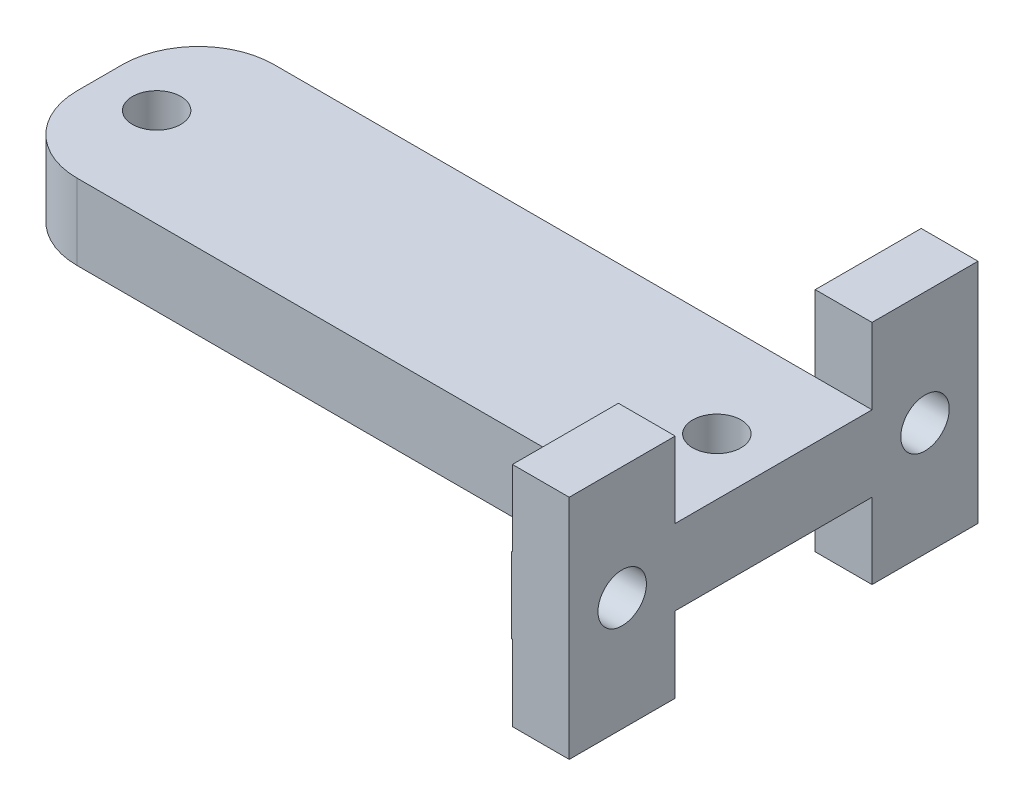
ISO-10303-21;
HEADER;
FILE_DESCRIPTION(('STEP AP214'),'2;1');
FILE_NAME('part.step','',(''),(''),'','','');
FILE_SCHEMA(('AUTOMOTIVE_DESIGN { 1 0 10303 214 1 1 1 1 }'));
ENDSEC;
DATA;
#1=APPLICATION_CONTEXT('core data for automotive mechanical design processes');
#2=APPLICATION_PROTOCOL_DEFINITION('international standard','automotive_design',2000,#1);
#3=PRODUCT_CONTEXT('',#1,'mechanical');
#4=PRODUCT('Part','Part','',(#3));
#5=PRODUCT_RELATED_PRODUCT_CATEGORY('part','',(#4));
#6=PRODUCT_DEFINITION_FORMATION('','',#4);
#7=PRODUCT_DEFINITION_CONTEXT('part definition',#1,'design');
#8=PRODUCT_DEFINITION('design','',#6,#7);
#9=PRODUCT_DEFINITION_SHAPE('','',#8);
#10=(LENGTH_UNIT() NAMED_UNIT(*) SI_UNIT(.MILLI.,.METRE.));
#11=(NAMED_UNIT(*) PLANE_ANGLE_UNIT() SI_UNIT($,.RADIAN.));
#12=(NAMED_UNIT(*) SI_UNIT($,.STERADIAN.) SOLID_ANGLE_UNIT());
#13=UNCERTAINTY_MEASURE_WITH_UNIT(LENGTH_MEASURE(1.E-05),#10,'distance_accuracy_value','');
#14=(GEOMETRIC_REPRESENTATION_CONTEXT(3) GLOBAL_UNCERTAINTY_ASSIGNED_CONTEXT((#13)) GLOBAL_UNIT_ASSIGNED_CONTEXT((#10,
#11,#12)) REPRESENTATION_CONTEXT('',''));
#15=CARTESIAN_POINT('',(0.,0.,0.));
#16=DIRECTION('',(0.,0.,1.));
#17=DIRECTION('',(1.,0.,0.));
#18=AXIS2_PLACEMENT_3D('',#15,#16,#17);
#19=CARTESIAN_POINT('',(0.,5.,-14.));
#20=DIRECTION('',(0.,1.,0.));
#21=DIRECTION('',(0.,0.,1.));
#22=AXIS2_PLACEMENT_3D('',#19,#20,#21);
#23=PLANE('',#22);
#24=CARTESIAN_POINT('',(53.9045527601739,5.,6.50000000000001));
#25=DIRECTION('',(0.,1.,0.));
#26=DIRECTION('',(0.,0.,1.));
#27=AXIS2_PLACEMENT_3D('',#24,#25,#26);
#28=CIRCLE('',#27,1.6);
#29=CARTESIAN_POINT('',(53.9045527601739,5.,8.1));
#30=VERTEX_POINT('',#29);
#31=EDGE_CURVE('E294',#30,#30,#28,.F.);
#32=ORIENTED_EDGE('',*,*,#31,.F.);
#33=EDGE_LOOP('',(#32));
#34=FACE_BOUND('',#33,.T.);
#35=CARTESIAN_POINT('',(16.9045527601739,5.,6.50000000000001));
#36=DIRECTION('',(0.,1.,0.));
#37=DIRECTION('',(0.,0.,1.));
#38=AXIS2_PLACEMENT_3D('',#35,#36,#37);
#39=CIRCLE('',#38,1.6);
#40=CARTESIAN_POINT('',(16.9045527601739,5.,8.10000000000001));
#41=VERTEX_POINT('',#40);
#42=EDGE_CURVE('E292',#41,#41,#39,.F.);
#43=ORIENTED_EDGE('',*,*,#42,.F.);
#44=EDGE_LOOP('',(#43));
#45=FACE_BOUND('',#44,.T.);
#46=DIRECTION('',(-1.,0.,0.));
#47=VECTOR('',#46,1.);
#48=CARTESIAN_POINT('',(0.,5.,0.));
#49=LINE('',#48,#47);
#50=CARTESIAN_POINT('',(53.9045527601739,5.,0.));
#51=VERTEX_POINT('',#50);
#52=CARTESIAN_POINT('',(18.1545527601739,5.,0.));
#53=VERTEX_POINT('',#52);
#54=EDGE_CURVE('E297',#51,#53,#49,.T.);
#55=ORIENTED_EDGE('',*,*,#54,.F.);
#56=DIRECTION('',(1.,0.,0.));
#57=VECTOR('',#56,1.);
#58=CARTESIAN_POINT('',(53.9045527601739,5.,0.));
#59=LINE('',#58,#57);
#60=CARTESIAN_POINT('',(57.6545527601739,5.,0.));
#61=VERTEX_POINT('',#60);
#62=EDGE_CURVE('E188',#51,#61,#59,.T.);
#63=ORIENTED_EDGE('',*,*,#62,.T.);
#64=DIRECTION('',(0.,0.,1.));
#65=VECTOR('',#64,1.);
#66=CARTESIAN_POINT('',(57.6545527601739,5.,-14.));
#67=LINE('',#66,#65);
#68=CARTESIAN_POINT('',(57.6545527601739,5.,13.));
#69=VERTEX_POINT('',#68);
#70=EDGE_CURVE('E288',#61,#69,#67,.T.);
#71=ORIENTED_EDGE('',*,*,#70,.T.);
#72=DIRECTION('',(1.,0.,0.));
#73=VECTOR('',#72,1.);
#74=CARTESIAN_POINT('',(53.9045527601739,5.,13.));
#75=LINE('',#74,#73);
#76=CARTESIAN_POINT('',(53.9045527601739,5.,13.));
#77=VERTEX_POINT('',#76);
#78=EDGE_CURVE('E233',#77,#69,#75,.T.);
#79=ORIENTED_EDGE('',*,*,#78,.F.);
#80=DIRECTION('',(0.,0.,1.));
#81=VECTOR('',#80,1.);
#82=CARTESIAN_POINT('',(53.9045527601739,5.,13.));
#83=LINE('',#82,#81);
#84=CARTESIAN_POINT('',(53.9045527601739,5.,20.));
#85=VERTEX_POINT('',#84);
#86=EDGE_CURVE('E218',#77,#85,#83,.T.);
#87=ORIENTED_EDGE('',*,*,#86,.T.);
#88=DIRECTION('',(1.,0.,0.));
#89=VECTOR('',#88,1.);
#90=CARTESIAN_POINT('',(53.848670826652,5.,20.));
#91=LINE('',#90,#89);
#92=CARTESIAN_POINT('',(53.848670826652,5.,20.));
#93=VERTEX_POINT('',#92);
#94=EDGE_CURVE('E272',#93,#85,#91,.T.);
#95=ORIENTED_EDGE('',*,*,#94,.F.);
#96=DIRECTION('',(0.,0.,-1.));
#97=VECTOR('',#96,1.);
#98=CARTESIAN_POINT('',(53.848670826652,5.,20.));
#99=LINE('',#98,#97);
#100=CARTESIAN_POINT('',(53.848670826652,5.,13.));
#101=VERTEX_POINT('',#100);
#102=EDGE_CURVE('E277',#93,#101,#99,.T.);
#103=ORIENTED_EDGE('',*,*,#102,.T.);
#104=DIRECTION('',(-1.,0.,0.));
#105=VECTOR('',#104,1.);
#106=CARTESIAN_POINT('',(0.,5.,13.));
#107=LINE('',#106,#105);
#108=CARTESIAN_POINT('',(18.1545527601739,5.,13.));
#109=VERTEX_POINT('',#108);
#110=EDGE_CURVE('E285',#101,#109,#107,.T.);
#111=ORIENTED_EDGE('',*,*,#110,.T.);
#112=CARTESIAN_POINT('',(18.1545527601739,5.,8.));
#113=DIRECTION('',(0.,1.,0.));
#114=DIRECTION('',(0.,0.,1.));
#115=AXIS2_PLACEMENT_3D('',#112,#113,#114);
#116=CIRCLE('',#115,5.);
#117=CARTESIAN_POINT('',(13.1545527601739,5.,8.));
#118=VERTEX_POINT('',#117);
#119=EDGE_CURVE('E331',#109,#118,#116,.F.);
#120=ORIENTED_EDGE('',*,*,#119,.T.);
#121=DIRECTION('',(0.,0.,1.));
#122=VECTOR('',#121,1.);
#123=CARTESIAN_POINT('',(13.1545527601739,5.,-14.));
#124=LINE('',#123,#122);
#125=CARTESIAN_POINT('',(13.1545527601739,5.,5.));
#126=VERTEX_POINT('',#125);
#127=EDGE_CURVE('E289',#126,#118,#124,.T.);
#128=ORIENTED_EDGE('',*,*,#127,.F.);
#129=CARTESIAN_POINT('',(18.1545527601739,5.,5.));
#130=DIRECTION('',(0.,1.,0.));
#131=DIRECTION('',(0.,0.,1.));
#132=AXIS2_PLACEMENT_3D('',#129,#130,#131);
#133=CIRCLE('',#132,5.);
#134=EDGE_CURVE('E326',#126,#53,#133,.F.);
#135=ORIENTED_EDGE('',*,*,#134,.T.);
#136=EDGE_LOOP('',(#55,#63,#71,#79,#87,#95,#103,#111,#120,#128,#135));
#137=FACE_BOUND('',#136,.T.);
#138=ADVANCED_FACE('F32',(#34,#45,#137),#23,.F.);
#139=CARTESIAN_POINT('',(0.,10.,0.));
#140=DIRECTION('',(0.,0.,1.));
#141=DIRECTION('',(1.,0.,0.));
#142=AXIS2_PLACEMENT_3D('',#139,#140,#141);
#143=PLANE('',#142);
#144=ORIENTED_EDGE('',*,*,#54,.T.);
#145=DIRECTION('',(0.,1.,0.));
#146=VECTOR('',#145,1.);
#147=CARTESIAN_POINT('',(18.1545527601739,10.,0.));
#148=LINE('',#147,#146);
#149=CARTESIAN_POINT('',(18.1545527601739,10.,0.));
#150=VERTEX_POINT('',#149);
#151=EDGE_CURVE('E317',#53,#150,#148,.T.);
#152=ORIENTED_EDGE('',*,*,#151,.T.);
#153=DIRECTION('',(-1.,0.,0.));
#154=VECTOR('',#153,1.);
#155=CARTESIAN_POINT('',(0.,10.,0.));
#156=LINE('',#155,#154);
#157=CARTESIAN_POINT('',(53.9045527601739,10.,0.));
#158=VERTEX_POINT('',#157);
#159=EDGE_CURVE('E314',#158,#150,#156,.T.);
#160=ORIENTED_EDGE('',*,*,#159,.F.);
#161=DIRECTION('',(0.,1.,0.));
#162=VECTOR('',#161,1.);
#163=CARTESIAN_POINT('',(53.9045527601739,10.,0.));
#164=LINE('',#163,#162);
#165=EDGE_CURVE('E258',#51,#158,#164,.T.);
#166=ORIENTED_EDGE('',*,*,#165,.F.);
#167=EDGE_LOOP('',(#144,#152,#160,#166));
#168=FACE_BOUND('',#167,.T.);
#169=ADVANCED_FACE('F379',(#168),#143,.F.);
#170=CARTESIAN_POINT('',(0.,10.,0.));
#171=DIRECTION('',(0.,-1.,0.));
#172=DIRECTION('',(0.,0.,-1.));
#173=AXIS2_PLACEMENT_3D('',#170,#171,#172);
#174=PLANE('',#173);
#175=CARTESIAN_POINT('',(16.9045527601739,10.,6.50000000000001));
#176=DIRECTION('',(0.,1.,0.));
#177=DIRECTION('',(0.,0.,1.));
#178=AXIS2_PLACEMENT_3D('',#175,#176,#177);
#179=CIRCLE('',#178,1.6);
#180=CARTESIAN_POINT('',(16.9045527601739,10.,8.10000000000001));
#181=VERTEX_POINT('',#180);
#182=EDGE_CURVE('E301',#181,#181,#179,.T.);
#183=ORIENTED_EDGE('',*,*,#182,.F.);
#184=EDGE_LOOP('',(#183));
#185=FACE_BOUND('',#184,.T.);
#186=CARTESIAN_POINT('',(53.9045527601739,10.,6.50000000000001));
#187=DIRECTION('',(0.,1.,0.));
#188=DIRECTION('',(0.,0.,1.));
#189=AXIS2_PLACEMENT_3D('',#186,#187,#188);
#190=CIRCLE('',#189,1.6);
#191=CARTESIAN_POINT('',(53.9045527601739,10.,8.1));
#192=VERTEX_POINT('',#191);
#193=EDGE_CURVE('E300',#192,#192,#190,.T.);
#194=ORIENTED_EDGE('',*,*,#193,.F.);
#195=EDGE_LOOP('',(#194));
#196=FACE_BOUND('',#195,.T.);
#197=DIRECTION('',(0.,0.,-1.));
#198=VECTOR('',#197,1.);
#199=CARTESIAN_POINT('',(57.6545527601739,10.,0.));
#200=LINE('',#199,#198);
#201=CARTESIAN_POINT('',(57.6545527601739,10.,13.));
#202=VERTEX_POINT('',#201);
#203=CARTESIAN_POINT('',(57.6545527601739,10.,0.));
#204=VERTEX_POINT('',#203);
#205=EDGE_CURVE('E304',#202,#204,#200,.T.);
#206=ORIENTED_EDGE('',*,*,#205,.T.);
#207=DIRECTION('',(1.,0.,0.));
#208=VECTOR('',#207,1.);
#209=CARTESIAN_POINT('',(53.9045527601739,10.,0.));
#210=LINE('',#209,#208);
#211=EDGE_CURVE('E211',#158,#204,#210,.T.);
#212=ORIENTED_EDGE('',*,*,#211,.F.);
#213=ORIENTED_EDGE('',*,*,#159,.T.);
#214=CARTESIAN_POINT('',(18.1545527601739,10.,5.));
#215=DIRECTION('',(0.,-1.,0.));
#216=DIRECTION('',(0.,0.,-1.));
#217=AXIS2_PLACEMENT_3D('',#214,#215,#216);
#218=CIRCLE('',#217,5.);
#219=CARTESIAN_POINT('',(13.1545527601739,10.,5.));
#220=VERTEX_POINT('',#219);
#221=EDGE_CURVE('E322',#150,#220,#218,.F.);
#222=ORIENTED_EDGE('',*,*,#221,.T.);
#223=DIRECTION('',(0.,0.,1.));
#224=VECTOR('',#223,1.);
#225=CARTESIAN_POINT('',(13.1545527601739,10.,0.));
#226=LINE('',#225,#224);
#227=CARTESIAN_POINT('',(13.1545527601739,10.,8.));
#228=VERTEX_POINT('',#227);
#229=EDGE_CURVE('E307',#220,#228,#226,.T.);
#230=ORIENTED_EDGE('',*,*,#229,.T.);
#231=CARTESIAN_POINT('',(18.1545527601739,10.,8.));
#232=DIRECTION('',(0.,-1.,0.));
#233=DIRECTION('',(0.,0.,-1.));
#234=AXIS2_PLACEMENT_3D('',#231,#232,#233);
#235=CIRCLE('',#234,5.);
#236=CARTESIAN_POINT('',(18.1545527601739,10.,13.));
#237=VERTEX_POINT('',#236);
#238=EDGE_CURVE('E11',#228,#237,#235,.F.);
#239=ORIENTED_EDGE('',*,*,#238,.T.);
#240=DIRECTION('',(1.,0.,0.));
#241=VECTOR('',#240,1.);
#242=CARTESIAN_POINT('',(0.,10.,13.));
#243=LINE('',#242,#241);
#244=CARTESIAN_POINT('',(53.848670826652,10.,13.));
#245=VERTEX_POINT('',#244);
#246=EDGE_CURVE('E310',#237,#245,#243,.T.);
#247=ORIENTED_EDGE('',*,*,#246,.T.);
#248=DIRECTION('',(0.,0.,-1.));
#249=VECTOR('',#248,1.);
#250=CARTESIAN_POINT('',(53.848670826652,10.,20.));
#251=LINE('',#250,#249);
#252=CARTESIAN_POINT('',(53.848670826652,10.,20.));
#253=VERTEX_POINT('',#252);
#254=EDGE_CURVE('E282',#253,#245,#251,.T.);
#255=ORIENTED_EDGE('',*,*,#254,.F.);
#256=DIRECTION('',(-1.,0.,0.));
#257=VECTOR('',#256,1.);
#258=CARTESIAN_POINT('',(57.6545527601739,10.,20.));
#259=LINE('',#258,#257);
#260=CARTESIAN_POINT('',(53.9045527601739,10.,20.));
#261=VERTEX_POINT('',#260);
#262=EDGE_CURVE('E268',#261,#253,#259,.T.);
#263=ORIENTED_EDGE('',*,*,#262,.F.);
#264=DIRECTION('',(0.,0.,-1.));
#265=VECTOR('',#264,1.);
#266=CARTESIAN_POINT('',(53.9045527601739,10.,13.));
#267=LINE('',#266,#265);
#268=CARTESIAN_POINT('',(53.9045527601739,10.,13.));
#269=VERTEX_POINT('',#268);
#270=EDGE_CURVE('E249',#261,#269,#267,.T.);
#271=ORIENTED_EDGE('',*,*,#270,.T.);
#272=DIRECTION('',(1.,0.,0.));
#273=VECTOR('',#272,1.);
#274=CARTESIAN_POINT('',(53.9045527601739,10.,13.));
#275=LINE('',#274,#273);
#276=EDGE_CURVE('E256',#269,#202,#275,.T.);
#277=ORIENTED_EDGE('',*,*,#276,.T.);
#278=EDGE_LOOP('',(#206,#212,#213,#222,#230,#239,#247,#255,#263,#271,#277));
#279=FACE_BOUND('',#278,.T.);
#280=ADVANCED_FACE('F342',(#185,#196,#279),#174,.F.);
#281=CARTESIAN_POINT('',(0.,-17.,13.));
#282=DIRECTION('',(0.,0.,1.));
#283=DIRECTION('',(1.,0.,0.));
#284=AXIS2_PLACEMENT_3D('',#281,#282,#283);
#285=PLANE('',#284);
#286=ORIENTED_EDGE('',*,*,#246,.F.);
#287=DIRECTION('',(0.,-1.,0.));
#288=VECTOR('',#287,1.);
#289=CARTESIAN_POINT('',(18.1545527601739,-17.,13.));
#290=LINE('',#289,#288);
#291=EDGE_CURVE('E328',#237,#109,#290,.T.);
#292=ORIENTED_EDGE('',*,*,#291,.T.);
#293=ORIENTED_EDGE('',*,*,#110,.F.);
#294=DIRECTION('',(0.,-1.,0.));
#295=VECTOR('',#294,1.);
#296=CARTESIAN_POINT('',(53.848670826652,10.,13.));
#297=LINE('',#296,#295);
#298=EDGE_CURVE('E266',#245,#101,#297,.T.);
#299=ORIENTED_EDGE('',*,*,#298,.F.);
#300=EDGE_LOOP('',(#286,#292,#293,#299));
#301=FACE_BOUND('',#300,.T.);
#302=ADVANCED_FACE('F346',(#301),#285,.T.);
#303=CARTESIAN_POINT('',(57.6545527601739,-17.,0.));
#304=DIRECTION('',(1.,0.,0.));
#305=DIRECTION('',(0.,0.,-1.));
#306=AXIS2_PLACEMENT_3D('',#303,#304,#305);
#307=PLANE('',#306);
#308=CARTESIAN_POINT('',(57.6545527601739,7.5,-3.5));
#309=DIRECTION('',(-1.,0.,0.));
#310=DIRECTION('',(0.,0.,1.));
#311=AXIS2_PLACEMENT_3D('',#308,#309,#310);
#312=CIRCLE('',#311,1.6);
#313=CARTESIAN_POINT('',(57.6545527601739,7.5,-1.9));
#314=VERTEX_POINT('',#313);
#315=EDGE_CURVE('E585',#314,#314,#312,.T.);
#316=ORIENTED_EDGE('',*,*,#315,.T.);
#317=EDGE_LOOP('',(#316));
#318=FACE_BOUND('',#317,.T.);
#319=CARTESIAN_POINT('',(57.6545527601739,7.5,16.5));
#320=DIRECTION('',(-1.,0.,0.));
#321=DIRECTION('',(0.,0.,1.));
#322=AXIS2_PLACEMENT_3D('',#319,#320,#321);
#323=CIRCLE('',#322,1.6);
#324=CARTESIAN_POINT('',(57.6545527601739,7.5,18.1));
#325=VERTEX_POINT('',#324);
#326=EDGE_CURVE('E582',#325,#325,#323,.T.);
#327=ORIENTED_EDGE('',*,*,#326,.T.);
#328=EDGE_LOOP('',(#327));
#329=FACE_BOUND('',#328,.T.);
#330=ORIENTED_EDGE('',*,*,#70,.F.);
#331=DIRECTION('',(0.,-1.,0.));
#332=VECTOR('',#331,1.);
#333=CARTESIAN_POINT('',(57.6545527601739,0.,0.));
#334=LINE('',#333,#332);
#335=CARTESIAN_POINT('',(57.6545527601739,0.,0.));
#336=VERTEX_POINT('',#335);
#337=EDGE_CURVE('E190',#61,#336,#334,.T.);
#338=ORIENTED_EDGE('',*,*,#337,.T.);
#339=DIRECTION('',(0.,0.,-1.));
#340=VECTOR('',#339,1.);
#341=CARTESIAN_POINT('',(57.6545527601739,0.,-7.));
#342=LINE('',#341,#340);
#343=CARTESIAN_POINT('',(57.6545527601739,0.,-7.));
#344=VERTEX_POINT('',#343);
#345=EDGE_CURVE('E170',#336,#344,#342,.T.);
#346=ORIENTED_EDGE('',*,*,#345,.T.);
#347=DIRECTION('',(0.,-1.,0.));
#348=VECTOR('',#347,1.);
#349=CARTESIAN_POINT('',(57.6545527601739,5.,-7.));
#350=LINE('',#349,#348);
#351=CARTESIAN_POINT('',(57.6545527601739,15.,-7.));
#352=VERTEX_POINT('',#351);
#353=EDGE_CURVE('E263',#352,#344,#350,.T.);
#354=ORIENTED_EDGE('',*,*,#353,.F.);
#355=DIRECTION('',(0.,0.,1.));
#356=VECTOR('',#355,1.);
#357=CARTESIAN_POINT('',(57.6545527601739,15.,-7.));
#358=LINE('',#357,#356);
#359=CARTESIAN_POINT('',(57.6545527601739,15.,0.));
#360=VERTEX_POINT('',#359);
#361=EDGE_CURVE('E198',#352,#360,#358,.T.);
#362=ORIENTED_EDGE('',*,*,#361,.T.);
#363=DIRECTION('',(0.,-1.,0.));
#364=VECTOR('',#363,1.);
#365=CARTESIAN_POINT('',(57.6545527601739,10.,0.));
#366=LINE('',#365,#364);
#367=EDGE_CURVE('E204',#360,#204,#366,.T.);
#368=ORIENTED_EDGE('',*,*,#367,.T.);
#369=ORIENTED_EDGE('',*,*,#205,.F.);
#370=DIRECTION('',(0.,1.,0.));
#371=VECTOR('',#370,1.);
#372=CARTESIAN_POINT('',(57.6545527601739,15.,13.));
#373=LINE('',#372,#371);
#374=CARTESIAN_POINT('',(57.6545527601739,15.,13.));
#375=VERTEX_POINT('',#374);
#376=EDGE_CURVE('E56',#202,#375,#373,.T.);
#377=ORIENTED_EDGE('',*,*,#376,.T.);
#378=DIRECTION('',(0.,0.,1.));
#379=VECTOR('',#378,1.);
#380=CARTESIAN_POINT('',(57.6545527601739,15.,20.));
#381=LINE('',#380,#379);
#382=CARTESIAN_POINT('',(57.6545527601739,15.,20.));
#383=VERTEX_POINT('',#382);
#384=EDGE_CURVE('E244',#375,#383,#381,.T.);
#385=ORIENTED_EDGE('',*,*,#384,.T.);
#386=DIRECTION('',(0.,1.,0.));
#387=VECTOR('',#386,1.);
#388=CARTESIAN_POINT('',(57.6545527601739,5.,20.));
#389=LINE('',#388,#387);
#390=CARTESIAN_POINT('',(57.6545527601739,0.,20.));
#391=VERTEX_POINT('',#390);
#392=EDGE_CURVE('E275',#391,#383,#389,.T.);
#393=ORIENTED_EDGE('',*,*,#392,.F.);
#394=DIRECTION('',(0.,0.,-1.));
#395=VECTOR('',#394,1.);
#396=CARTESIAN_POINT('',(57.6545527601739,0.,20.));
#397=LINE('',#396,#395);
#398=CARTESIAN_POINT('',(57.6545527601739,0.,13.));
#399=VERTEX_POINT('',#398);
#400=EDGE_CURVE('E213',#391,#399,#397,.T.);
#401=ORIENTED_EDGE('',*,*,#400,.T.);
#402=DIRECTION('',(0.,1.,0.));
#403=VECTOR('',#402,1.);
#404=CARTESIAN_POINT('',(57.6545527601739,0.,13.));
#405=LINE('',#404,#403);
#406=EDGE_CURVE('E220',#399,#69,#405,.T.);
#407=ORIENTED_EDGE('',*,*,#406,.T.);
#408=EDGE_LOOP('',(#330,#338,#346,#354,#362,#368,#369,#377,#385,#393,#401,#407));
#409=FACE_BOUND('',#408,.T.);
#410=ADVANCED_FACE('F371',(#318,#329,#409),#307,.T.);
#411=CARTESIAN_POINT('',(13.1545527601739,-17.,0.));
#412=DIRECTION('',(-1.,0.,0.));
#413=DIRECTION('',(0.,0.,1.));
#414=AXIS2_PLACEMENT_3D('',#411,#412,#413);
#415=PLANE('',#414);
#416=ORIENTED_EDGE('',*,*,#127,.T.);
#417=DIRECTION('',(0.,-1.,0.));
#418=VECTOR('',#417,1.);
#419=CARTESIAN_POINT('',(13.1545527601739,-17.,8.));
#420=LINE('',#419,#418);
#421=EDGE_CURVE('E41',#118,#228,#420,.F.);
#422=ORIENTED_EDGE('',*,*,#421,.T.);
#423=ORIENTED_EDGE('',*,*,#229,.F.);
#424=DIRECTION('',(0.,1.,0.));
#425=VECTOR('',#424,1.);
#426=CARTESIAN_POINT('',(13.1545527601739,5.,5.));
#427=LINE('',#426,#425);
#428=EDGE_CURVE('E324',#220,#126,#427,.F.);
#429=ORIENTED_EDGE('',*,*,#428,.T.);
#430=EDGE_LOOP('',(#416,#422,#423,#429));
#431=FACE_BOUND('',#430,.T.);
#432=ADVANCED_FACE('F336',(#431),#415,.T.);
#433=CARTESIAN_POINT('',(53.9045527601739,-17.,6.50000000000001));
#434=DIRECTION('',(0.,1.,0.));
#435=DIRECTION('',(0.,0.,1.));
#436=AXIS2_PLACEMENT_3D('',#433,#434,#435);
#437=CYLINDRICAL_SURFACE('',#436,1.6);
#438=ORIENTED_EDGE('',*,*,#31,.T.);
#439=EDGE_LOOP('',(#438));
#440=FACE_BOUND('',#439,.T.);
#441=ORIENTED_EDGE('',*,*,#193,.T.);
#442=EDGE_LOOP('',(#441));
#443=FACE_BOUND('',#442,.T.);
#444=ADVANCED_FACE('F413',(#440,#443),#437,.F.);
#445=CARTESIAN_POINT('',(16.9045527601739,-17.,6.50000000000001));
#446=DIRECTION('',(0.,1.,0.));
#447=DIRECTION('',(0.,0.,1.));
#448=AXIS2_PLACEMENT_3D('',#445,#446,#447);
#449=CYLINDRICAL_SURFACE('',#448,1.6);
#450=ORIENTED_EDGE('',*,*,#42,.T.);
#451=EDGE_LOOP('',(#450));
#452=FACE_BOUND('',#451,.T.);
#453=ORIENTED_EDGE('',*,*,#182,.T.);
#454=EDGE_LOOP('',(#453));
#455=FACE_BOUND('',#454,.T.);
#456=ADVANCED_FACE('F410',(#452,#455),#449,.F.);
#457=CARTESIAN_POINT('',(53.848670826652,10.,20.));
#458=DIRECTION('',(1.,0.,0.));
#459=DIRECTION('',(0.,0.,-1.));
#460=AXIS2_PLACEMENT_3D('',#457,#458,#459);
#461=PLANE('',#460);
#462=CARTESIAN_POINT('',(53.848670826652,7.5,16.5));
#463=DIRECTION('',(-1.,0.,0.));
#464=DIRECTION('',(0.,0.,1.));
#465=AXIS2_PLACEMENT_3D('',#462,#463,#464);
#466=CIRCLE('',#465,1.6);
#467=CARTESIAN_POINT('',(53.848670826652,7.5,18.1));
#468=VERTEX_POINT('',#467);
#469=EDGE_CURVE('E193',#468,#468,#466,.T.);
#470=ORIENTED_EDGE('',*,*,#469,.F.);
#471=EDGE_LOOP('',(#470));
#472=FACE_BOUND('',#471,.T.);
#473=ORIENTED_EDGE('',*,*,#298,.T.);
#474=ORIENTED_EDGE('',*,*,#102,.F.);
#475=DIRECTION('',(0.,-1.,0.));
#476=VECTOR('',#475,1.);
#477=CARTESIAN_POINT('',(53.848670826652,10.,20.));
#478=LINE('',#477,#476);
#479=EDGE_CURVE('E270',#253,#93,#478,.T.);
#480=ORIENTED_EDGE('',*,*,#479,.F.);
#481=ORIENTED_EDGE('',*,*,#254,.T.);
#482=EDGE_LOOP('',(#473,#474,#480,#481));
#483=FACE_BOUND('',#482,.T.);
#484=ADVANCED_FACE('F354',(#472,#483),#461,.F.);
#485=CARTESIAN_POINT('',(0.,0.,20.));
#486=DIRECTION('',(0.,0.,1.));
#487=DIRECTION('',(1.,0.,0.));
#488=AXIS2_PLACEMENT_3D('',#485,#486,#487);
#489=PLANE('',#488);
#490=ORIENTED_EDGE('',*,*,#392,.T.);
#491=DIRECTION('',(1.,0.,0.));
#492=VECTOR('',#491,1.);
#493=CARTESIAN_POINT('',(53.9045527601739,15.,20.));
#494=LINE('',#493,#492);
#495=CARTESIAN_POINT('',(53.9045527601739,15.,20.));
#496=VERTEX_POINT('',#495);
#497=EDGE_CURVE('E259',#496,#383,#494,.T.);
#498=ORIENTED_EDGE('',*,*,#497,.F.);
#499=DIRECTION('',(0.,-1.,0.));
#500=VECTOR('',#499,1.);
#501=CARTESIAN_POINT('',(53.9045527601739,10.,20.));
#502=LINE('',#501,#500);
#503=EDGE_CURVE('E247',#496,#261,#502,.T.);
#504=ORIENTED_EDGE('',*,*,#503,.T.);
#505=ORIENTED_EDGE('',*,*,#262,.T.);
#506=ORIENTED_EDGE('',*,*,#479,.T.);
#507=ORIENTED_EDGE('',*,*,#94,.T.);
#508=DIRECTION('',(0.,-1.,0.));
#509=VECTOR('',#508,1.);
#510=CARTESIAN_POINT('',(53.9045527601739,5.,20.));
#511=LINE('',#510,#509);
#512=CARTESIAN_POINT('',(53.9045527601739,0.,20.));
#513=VERTEX_POINT('',#512);
#514=EDGE_CURVE('E48',#85,#513,#511,.T.);
#515=ORIENTED_EDGE('',*,*,#514,.T.);
#516=DIRECTION('',(1.,0.,0.));
#517=VECTOR('',#516,1.);
#518=CARTESIAN_POINT('',(53.9045527601739,0.,20.));
#519=LINE('',#518,#517);
#520=EDGE_CURVE('E228',#513,#391,#519,.T.);
#521=ORIENTED_EDGE('',*,*,#520,.T.);
#522=EDGE_LOOP('',(#490,#498,#504,#505,#506,#507,#515,#521));
#523=FACE_BOUND('',#522,.T.);
#524=ADVANCED_FACE('F359',(#523),#489,.T.);
#525=CARTESIAN_POINT('',(53.9045527601739,10.,-7.));
#526=DIRECTION('',(1.,0.,0.));
#527=DIRECTION('',(0.,0.,-1.));
#528=AXIS2_PLACEMENT_3D('',#525,#526,#527);
#529=PLANE('',#528);
#530=CARTESIAN_POINT('',(53.9045527601739,7.5,-3.5));
#531=DIRECTION('',(1.,0.,0.));
#532=DIRECTION('',(0.,0.,-1.));
#533=AXIS2_PLACEMENT_3D('',#530,#531,#532);
#534=CIRCLE('',#533,1.6);
#535=CARTESIAN_POINT('',(53.9045527601739,7.5,-5.1));
#536=VERTEX_POINT('',#535);
#537=EDGE_CURVE('E36',#536,#536,#534,.T.);
#538=ORIENTED_EDGE('',*,*,#537,.T.);
#539=EDGE_LOOP('',(#538));
#540=FACE_BOUND('',#539,.T.);
#541=ORIENTED_EDGE('',*,*,#165,.T.);
#542=DIRECTION('',(0.,-1.,0.));
#543=VECTOR('',#542,1.);
#544=CARTESIAN_POINT('',(53.9045527601739,10.,0.));
#545=LINE('',#544,#543);
#546=CARTESIAN_POINT('',(53.9045527601739,15.,0.));
#547=VERTEX_POINT('',#546);
#548=EDGE_CURVE('E203',#547,#158,#545,.T.);
#549=ORIENTED_EDGE('',*,*,#548,.F.);
#550=DIRECTION('',(0.,0.,1.));
#551=VECTOR('',#550,1.);
#552=CARTESIAN_POINT('',(53.9045527601739,15.,-7.));
#553=LINE('',#552,#551);
#554=CARTESIAN_POINT('',(53.9045527601739,15.,-7.));
#555=VERTEX_POINT('',#554);
#556=EDGE_CURVE('E200',#555,#547,#553,.T.);
#557=ORIENTED_EDGE('',*,*,#556,.F.);
#558=DIRECTION('',(0.,1.,0.));
#559=VECTOR('',#558,1.);
#560=CARTESIAN_POINT('',(53.9045527601739,10.,-7.));
#561=LINE('',#560,#559);
#562=CARTESIAN_POINT('',(53.9045527601739,0.,-7.));
#563=VERTEX_POINT('',#562);
#564=EDGE_CURVE('E183',#563,#555,#561,.T.);
#565=ORIENTED_EDGE('',*,*,#564,.F.);
#566=DIRECTION('',(0.,0.,-1.));
#567=VECTOR('',#566,1.);
#568=CARTESIAN_POINT('',(53.9045527601739,0.,-7.));
#569=LINE('',#568,#567);
#570=CARTESIAN_POINT('',(53.9045527601739,0.,0.));
#571=VERTEX_POINT('',#570);
#572=EDGE_CURVE('E168',#571,#563,#569,.T.);
#573=ORIENTED_EDGE('',*,*,#572,.F.);
#574=DIRECTION('',(0.,-1.,0.));
#575=VECTOR('',#574,1.);
#576=CARTESIAN_POINT('',(53.9045527601739,0.,0.));
#577=LINE('',#576,#575);
#578=EDGE_CURVE('E180',#51,#571,#577,.T.);
#579=ORIENTED_EDGE('',*,*,#578,.F.);
#580=EDGE_LOOP('',(#541,#549,#557,#565,#573,#579));
#581=FACE_BOUND('',#580,.T.);
#582=ADVANCED_FACE('F179',(#540,#581),#529,.F.);
#583=CARTESIAN_POINT('',(0.,0.,-7.));
#584=DIRECTION('',(0.,0.,1.));
#585=DIRECTION('',(1.,0.,0.));
#586=AXIS2_PLACEMENT_3D('',#583,#584,#585);
#587=PLANE('',#586);
#588=ORIENTED_EDGE('',*,*,#564,.T.);
#589=DIRECTION('',(1.,0.,0.));
#590=VECTOR('',#589,1.);
#591=CARTESIAN_POINT('',(53.9045527601739,15.,-7.));
#592=LINE('',#591,#590);
#593=EDGE_CURVE('E206',#555,#352,#592,.T.);
#594=ORIENTED_EDGE('',*,*,#593,.T.);
#595=ORIENTED_EDGE('',*,*,#353,.T.);
#596=DIRECTION('',(1.,0.,0.));
#597=VECTOR('',#596,1.);
#598=CARTESIAN_POINT('',(53.9045527601739,0.,-7.));
#599=LINE('',#598,#597);
#600=EDGE_CURVE('E174',#563,#344,#599,.T.);
#601=ORIENTED_EDGE('',*,*,#600,.F.);
#602=EDGE_LOOP('',(#588,#594,#595,#601));
#603=FACE_BOUND('',#602,.T.);
#604=ADVANCED_FACE('F385',(#603),#587,.F.);
#605=CARTESIAN_POINT('',(18.1545527601739,10.,5.));
#606=DIRECTION('',(0.,-1.,0.));
#607=DIRECTION('',(0.,0.,-1.));
#608=AXIS2_PLACEMENT_3D('',#605,#606,#607);
#609=CYLINDRICAL_SURFACE('',#608,5.);
#610=ORIENTED_EDGE('',*,*,#134,.F.);
#611=ORIENTED_EDGE('',*,*,#428,.F.);
#612=ORIENTED_EDGE('',*,*,#221,.F.);
#613=ORIENTED_EDGE('',*,*,#151,.F.);
#614=EDGE_LOOP('',(#610,#611,#612,#613));
#615=FACE_BOUND('',#614,.T.);
#616=ADVANCED_FACE('F389',(#615),#609,.T.);
#617=CARTESIAN_POINT('',(18.1545527601739,-17.,8.));
#618=DIRECTION('',(0.,-1.,0.));
#619=DIRECTION('',(0.,0.,-1.));
#620=AXIS2_PLACEMENT_3D('',#617,#618,#619);
#621=CYLINDRICAL_SURFACE('',#620,5.);
#622=ORIENTED_EDGE('',*,*,#238,.F.);
#623=ORIENTED_EDGE('',*,*,#421,.F.);
#624=ORIENTED_EDGE('',*,*,#119,.F.);
#625=ORIENTED_EDGE('',*,*,#291,.F.);
#626=EDGE_LOOP('',(#622,#623,#624,#625));
#627=FACE_BOUND('',#626,.T.);
#628=ADVANCED_FACE('F34',(#627),#621,.T.);
#629=CARTESIAN_POINT('',(53.9045527601739,15.,13.));
#630=DIRECTION('',(0.,0.,-1.));
#631=DIRECTION('',(-1.,0.,0.));
#632=AXIS2_PLACEMENT_3D('',#629,#630,#631);
#633=PLANE('',#632);
#634=ORIENTED_EDGE('',*,*,#376,.F.);
#635=ORIENTED_EDGE('',*,*,#276,.F.);
#636=DIRECTION('',(0.,1.,0.));
#637=VECTOR('',#636,1.);
#638=CARTESIAN_POINT('',(53.9045527601739,15.,13.));
#639=LINE('',#638,#637);
#640=CARTESIAN_POINT('',(53.9045527601739,15.,13.));
#641=VERTEX_POINT('',#640);
#642=EDGE_CURVE('E240',#269,#641,#639,.T.);
#643=ORIENTED_EDGE('',*,*,#642,.T.);
#644=DIRECTION('',(1.,0.,0.));
#645=VECTOR('',#644,1.);
#646=CARTESIAN_POINT('',(53.9045527601739,15.,13.));
#647=LINE('',#646,#645);
#648=EDGE_CURVE('E252',#641,#375,#647,.T.);
#649=ORIENTED_EDGE('',*,*,#648,.T.);
#650=EDGE_LOOP('',(#634,#635,#643,#649));
#651=FACE_BOUND('',#650,.T.);
#652=ADVANCED_FACE('F365',(#651),#633,.T.);
#653=CARTESIAN_POINT('',(53.9045527601739,15.,20.));
#654=DIRECTION('',(0.,1.,0.));
#655=DIRECTION('',(0.,0.,1.));
#656=AXIS2_PLACEMENT_3D('',#653,#654,#655);
#657=PLANE('',#656);
#658=ORIENTED_EDGE('',*,*,#384,.F.);
#659=ORIENTED_EDGE('',*,*,#648,.F.);
#660=DIRECTION('',(0.,0.,1.));
#661=VECTOR('',#660,1.);
#662=CARTESIAN_POINT('',(53.9045527601739,15.,20.));
#663=LINE('',#662,#661);
#664=EDGE_CURVE('E243',#641,#496,#663,.T.);
#665=ORIENTED_EDGE('',*,*,#664,.T.);
#666=ORIENTED_EDGE('',*,*,#497,.T.);
#667=EDGE_LOOP('',(#658,#659,#665,#666));
#668=FACE_BOUND('',#667,.T.);
#669=ADVANCED_FACE('F462',(#668),#657,.T.);
#670=CARTESIAN_POINT('',(53.9045527601739,0.,0.));
#671=DIRECTION('',(-1.,0.,0.));
#672=DIRECTION('',(0.,0.,1.));
#673=AXIS2_PLACEMENT_3D('',#670,#671,#672);
#674=PLANE('',#673);
#675=ORIENTED_EDGE('',*,*,#642,.F.);
#676=ORIENTED_EDGE('',*,*,#270,.F.);
#677=ORIENTED_EDGE('',*,*,#503,.F.);
#678=ORIENTED_EDGE('',*,*,#664,.F.);
#679=EDGE_LOOP('',(#675,#676,#677,#678));
#680=FACE_BOUND('',#679,.T.);
#681=ADVANCED_FACE('F364',(#680),#674,.T.);
#682=CARTESIAN_POINT('',(53.9045527601739,0.,13.));
#683=DIRECTION('',(0.,0.,-1.));
#684=DIRECTION('',(0.,1.,0.));
#685=AXIS2_PLACEMENT_3D('',#682,#683,#684);
#686=PLANE('',#685);
#687=ORIENTED_EDGE('',*,*,#406,.F.);
#688=DIRECTION('',(1.,0.,0.));
#689=VECTOR('',#688,1.);
#690=CARTESIAN_POINT('',(53.9045527601739,0.,13.));
#691=LINE('',#690,#689);
#692=CARTESIAN_POINT('',(53.9045527601739,0.,13.));
#693=VERTEX_POINT('',#692);
#694=EDGE_CURVE('E236',#693,#399,#691,.T.);
#695=ORIENTED_EDGE('',*,*,#694,.F.);
#696=DIRECTION('',(0.,1.,0.));
#697=VECTOR('',#696,1.);
#698=CARTESIAN_POINT('',(53.9045527601739,0.,13.));
#699=LINE('',#698,#697);
#700=EDGE_CURVE('E225',#693,#77,#699,.T.);
#701=ORIENTED_EDGE('',*,*,#700,.T.);
#702=ORIENTED_EDGE('',*,*,#78,.T.);
#703=EDGE_LOOP('',(#687,#695,#701,#702));
#704=FACE_BOUND('',#703,.T.);
#705=ADVANCED_FACE('F480',(#704),#686,.T.);
#706=CARTESIAN_POINT('',(53.9045527601739,0.,20.));
#707=DIRECTION('',(0.,-1.,0.));
#708=DIRECTION('',(0.,0.,-1.));
#709=AXIS2_PLACEMENT_3D('',#706,#707,#708);
#710=PLANE('',#709);
#711=ORIENTED_EDGE('',*,*,#400,.F.);
#712=ORIENTED_EDGE('',*,*,#520,.F.);
#713=DIRECTION('',(0.,0.,-1.));
#714=VECTOR('',#713,1.);
#715=CARTESIAN_POINT('',(53.9045527601739,0.,20.));
#716=LINE('',#715,#714);
#717=EDGE_CURVE('E222',#513,#693,#716,.T.);
#718=ORIENTED_EDGE('',*,*,#717,.T.);
#719=ORIENTED_EDGE('',*,*,#694,.T.);
#720=EDGE_LOOP('',(#711,#712,#718,#719));
#721=FACE_BOUND('',#720,.T.);
#722=ADVANCED_FACE('F489',(#721),#710,.T.);
#723=CARTESIAN_POINT('',(53.9045527601739,0.,0.));
#724=DIRECTION('',(1.,0.,0.));
#725=DIRECTION('',(0.,0.,-1.));
#726=AXIS2_PLACEMENT_3D('',#723,#724,#725);
#727=PLANE('',#726);
#728=ORIENTED_EDGE('',*,*,#86,.F.);
#729=ORIENTED_EDGE('',*,*,#700,.F.);
#730=ORIENTED_EDGE('',*,*,#717,.F.);
#731=ORIENTED_EDGE('',*,*,#514,.F.);
#732=EDGE_LOOP('',(#728,#729,#730,#731));
#733=FACE_BOUND('',#732,.T.);
#734=ADVANCED_FACE('F499',(#733),#727,.F.);
#735=CARTESIAN_POINT('',(53.9045527601739,10.,0.));
#736=DIRECTION('',(0.,0.,1.));
#737=DIRECTION('',(1.,0.,0.));
#738=AXIS2_PLACEMENT_3D('',#735,#736,#737);
#739=PLANE('',#738);
#740=ORIENTED_EDGE('',*,*,#367,.F.);
#741=DIRECTION('',(1.,0.,0.));
#742=VECTOR('',#741,1.);
#743=CARTESIAN_POINT('',(53.9045527601739,15.,0.));
#744=LINE('',#743,#742);
#745=EDGE_CURVE('E214',#547,#360,#744,.T.);
#746=ORIENTED_EDGE('',*,*,#745,.F.);
#747=ORIENTED_EDGE('',*,*,#548,.T.);
#748=ORIENTED_EDGE('',*,*,#211,.T.);
#749=EDGE_LOOP('',(#740,#746,#747,#748));
#750=FACE_BOUND('',#749,.T.);
#751=ADVANCED_FACE('F375',(#750),#739,.T.);
#752=CARTESIAN_POINT('',(53.9045527601739,15.,-7.));
#753=DIRECTION('',(0.,1.,0.));
#754=DIRECTION('',(0.,0.,1.));
#755=AXIS2_PLACEMENT_3D('',#752,#753,#754);
#756=PLANE('',#755);
#757=ORIENTED_EDGE('',*,*,#361,.F.);
#758=ORIENTED_EDGE('',*,*,#593,.F.);
#759=ORIENTED_EDGE('',*,*,#556,.T.);
#760=ORIENTED_EDGE('',*,*,#745,.T.);
#761=EDGE_LOOP('',(#757,#758,#759,#760));
#762=FACE_BOUND('',#761,.T.);
#763=ADVANCED_FACE('F383',(#762),#756,.T.);
#764=CARTESIAN_POINT('',(53.9045527601739,0.,0.));
#765=DIRECTION('',(0.,0.,1.));
#766=DIRECTION('',(1.,0.,0.));
#767=AXIS2_PLACEMENT_3D('',#764,#765,#766);
#768=PLANE('',#767);
#769=ORIENTED_EDGE('',*,*,#337,.F.);
#770=ORIENTED_EDGE('',*,*,#62,.F.);
#771=ORIENTED_EDGE('',*,*,#578,.T.);
#772=DIRECTION('',(1.,0.,0.));
#773=VECTOR('',#772,1.);
#774=CARTESIAN_POINT('',(53.9045527601739,0.,0.));
#775=LINE('',#774,#773);
#776=EDGE_CURVE('E164',#571,#336,#775,.T.);
#777=ORIENTED_EDGE('',*,*,#776,.T.);
#778=EDGE_LOOP('',(#769,#770,#771,#777));
#779=FACE_BOUND('',#778,.T.);
#780=ADVANCED_FACE('F186',(#779),#768,.T.);
#781=CARTESIAN_POINT('',(53.9045527601739,0.,-7.));
#782=DIRECTION('',(0.,-1.,0.));
#783=DIRECTION('',(0.,0.,-1.));
#784=AXIS2_PLACEMENT_3D('',#781,#782,#783);
#785=PLANE('',#784);
#786=ORIENTED_EDGE('',*,*,#345,.F.);
#787=ORIENTED_EDGE('',*,*,#776,.F.);
#788=ORIENTED_EDGE('',*,*,#572,.T.);
#789=ORIENTED_EDGE('',*,*,#600,.T.);
#790=EDGE_LOOP('',(#786,#787,#788,#789));
#791=FACE_BOUND('',#790,.T.);
#792=ADVANCED_FACE('F166',(#791),#785,.T.);
#793=CARTESIAN_POINT('',(57.6545527601739,7.5,-3.5));
#794=DIRECTION('',(-1.,0.,0.));
#795=DIRECTION('',(0.,0.,1.));
#796=AXIS2_PLACEMENT_3D('',#793,#794,#795);
#797=CYLINDRICAL_SURFACE('',#796,1.6);
#798=ORIENTED_EDGE('',*,*,#315,.F.);
#799=EDGE_LOOP('',(#798));
#800=FACE_BOUND('',#799,.T.);
#801=ORIENTED_EDGE('',*,*,#537,.F.);
#802=EDGE_LOOP('',(#801));
#803=FACE_BOUND('',#802,.T.);
#804=ADVANCED_FACE('F540',(#800,#803),#797,.F.);
#805=CARTESIAN_POINT('',(57.6545527601739,7.5,16.5));
#806=DIRECTION('',(-1.,0.,0.));
#807=DIRECTION('',(0.,0.,1.));
#808=AXIS2_PLACEMENT_3D('',#805,#806,#807);
#809=CYLINDRICAL_SURFACE('',#808,1.6);
#810=ORIENTED_EDGE('',*,*,#326,.F.);
#811=EDGE_LOOP('',(#810));
#812=FACE_BOUND('',#811,.T.);
#813=ORIENTED_EDGE('',*,*,#469,.T.);
#814=EDGE_LOOP('',(#813));
#815=FACE_BOUND('',#814,.T.);
#816=ADVANCED_FACE('F565',(#812,#815),#809,.F.);
#817=CLOSED_SHELL('',(#138,#169,#280,#302,#410,#432,#444,#456,#484,#524,#582,#604,#616,#628,
#652,#669,#681,#705,#722,#734,#751,#763,#780,#792,#804,#816));
#818=MANIFOLD_SOLID_BREP('B2',#817);
#819=ADVANCED_BREP_SHAPE_REPRESENTATION('',(#18,#818),#14);
#820=SHAPE_DEFINITION_REPRESENTATION(#9,#819);
ENDSEC;
END-ISO-10303-21;
